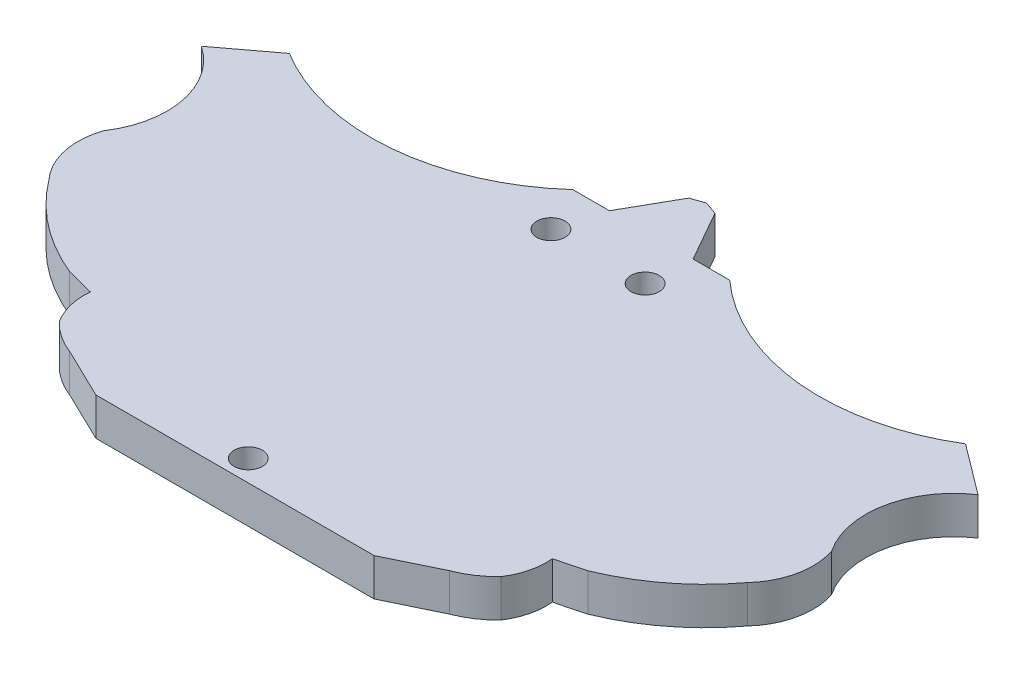
ISO-10303-21;
HEADER;
FILE_DESCRIPTION(('STEP AP214'),'2;1');
FILE_NAME('part.step','',(''),(''),'','','');
FILE_SCHEMA(('AUTOMOTIVE_DESIGN { 1 0 10303 214 1 1 1 1 }'));
ENDSEC;
DATA;
#1=APPLICATION_CONTEXT('core data for automotive mechanical design processes');
#2=APPLICATION_PROTOCOL_DEFINITION('international standard','automotive_design',2000,#1);
#3=PRODUCT_CONTEXT('',#1,'mechanical');
#4=PRODUCT('Part','Part','',(#3));
#5=PRODUCT_RELATED_PRODUCT_CATEGORY('part','',(#4));
#6=PRODUCT_DEFINITION_FORMATION('','',#4);
#7=PRODUCT_DEFINITION_CONTEXT('part definition',#1,'design');
#8=PRODUCT_DEFINITION('design','',#6,#7);
#9=PRODUCT_DEFINITION_SHAPE('','',#8);
#10=(LENGTH_UNIT() NAMED_UNIT(*) SI_UNIT(.MILLI.,.METRE.));
#11=(NAMED_UNIT(*) PLANE_ANGLE_UNIT() SI_UNIT($,.RADIAN.));
#12=(NAMED_UNIT(*) SI_UNIT($,.STERADIAN.) SOLID_ANGLE_UNIT());
#13=UNCERTAINTY_MEASURE_WITH_UNIT(LENGTH_MEASURE(1.E-05),#10,'distance_accuracy_value','');
#14=(GEOMETRIC_REPRESENTATION_CONTEXT(3) GLOBAL_UNCERTAINTY_ASSIGNED_CONTEXT((#13)) GLOBAL_UNIT_ASSIGNED_CONTEXT((#10,
#11,#12)) REPRESENTATION_CONTEXT('',''));
#15=CARTESIAN_POINT('',(0.,0.,0.));
#16=DIRECTION('',(0.,0.,1.));
#17=DIRECTION('',(1.,0.,0.));
#18=AXIS2_PLACEMENT_3D('',#15,#16,#17);
#19=CARTESIAN_POINT('',(-11.9681457477177,3.,24.5157227328065));
#20=DIRECTION('',(0.435219585741613,0.,-0.900324337217927));
#21=DIRECTION('',(-0.900324337217927,0.,-0.435219585741613));
#22=AXIS2_PLACEMENT_3D('',#19,#20,#21);
#23=PLANE('',#22);
#24=DIRECTION('',(0.900324337217927,0.,0.435219585741613));
#25=VECTOR('',#24,1.);
#26=CARTESIAN_POINT('',(-11.9681457477177,-1.,24.5157227328065));
#27=LINE('',#26,#25);
#28=CARTESIAN_POINT('',(-20.1802491308316,-1.,20.5459664075357));
#29=VERTEX_POINT('',#28);
#30=CARTESIAN_POINT('',(-14.7831965238283,-1.,23.1549184293193));
#31=VERTEX_POINT('',#30);
#32=EDGE_CURVE('E237',#29,#31,#27,.T.);
#33=ORIENTED_EDGE('',*,*,#32,.T.);
#34=DIRECTION('',(0.,-1.,0.));
#35=VECTOR('',#34,1.);
#36=CARTESIAN_POINT('',(-14.7831965238283,3.,23.1549184293193));
#37=LINE('',#36,#35);
#38=CARTESIAN_POINT('',(-14.7831965238283,3.,23.1549184293193));
#39=VERTEX_POINT('',#38);
#40=EDGE_CURVE('E11',#39,#31,#37,.T.);
#41=ORIENTED_EDGE('',*,*,#40,.F.);
#42=DIRECTION('',(0.900324337217927,0.,0.435219585741613));
#43=VECTOR('',#42,1.);
#44=CARTESIAN_POINT('',(-11.9681457477177,3.,24.5157227328065));
#45=LINE('',#44,#43);
#46=CARTESIAN_POINT('',(-20.1802491308316,3.,20.5459664075357));
#47=VERTEX_POINT('',#46);
#48=EDGE_CURVE('E301',#47,#39,#45,.T.);
#49=ORIENTED_EDGE('',*,*,#48,.F.);
#50=DIRECTION('',(0.,-1.,0.));
#51=VECTOR('',#50,1.);
#52=CARTESIAN_POINT('',(-20.1802491308316,3.,20.5459664075357));
#53=LINE('',#52,#51);
#54=EDGE_CURVE('E233',#47,#29,#53,.T.);
#55=ORIENTED_EDGE('',*,*,#54,.T.);
#56=EDGE_LOOP('',(#33,#41,#49,#55));
#57=FACE_BOUND('',#56,.T.);
#58=ADVANCED_FACE('F38',(#57),#23,.F.);
#59=CARTESIAN_POINT('',(0.,3.,23.1549184293193));
#60=DIRECTION('',(0.,0.,-1.));
#61=DIRECTION('',(-1.,0.,0.));
#62=AXIS2_PLACEMENT_3D('',#59,#60,#61);
#63=PLANE('',#62);
#64=DIRECTION('',(1.,0.,0.));
#65=VECTOR('',#64,1.);
#66=CARTESIAN_POINT('',(0.,-1.,23.1549184293193));
#67=LINE('',#66,#65);
#68=CARTESIAN_POINT('',(14.7831965238283,-1.,23.1549184293193));
#69=VERTEX_POINT('',#68);
#70=EDGE_CURVE('E240',#31,#69,#67,.T.);
#71=ORIENTED_EDGE('',*,*,#70,.T.);
#72=DIRECTION('',(0.,-1.,0.));
#73=VECTOR('',#72,1.);
#74=CARTESIAN_POINT('',(14.7831965238283,3.,23.1549184293193));
#75=LINE('',#74,#73);
#76=CARTESIAN_POINT('',(14.7831965238283,3.,23.1549184293193));
#77=VERTEX_POINT('',#76);
#78=EDGE_CURVE('E47',#77,#69,#75,.T.);
#79=ORIENTED_EDGE('',*,*,#78,.F.);
#80=DIRECTION('',(1.,0.,0.));
#81=VECTOR('',#80,1.);
#82=CARTESIAN_POINT('',(0.,3.,23.1549184293193));
#83=LINE('',#82,#81);
#84=EDGE_CURVE('E149',#39,#77,#83,.T.);
#85=ORIENTED_EDGE('',*,*,#84,.F.);
#86=ORIENTED_EDGE('',*,*,#40,.T.);
#87=EDGE_LOOP('',(#71,#79,#85,#86));
#88=FACE_BOUND('',#87,.T.);
#89=ADVANCED_FACE('F352',(#88),#63,.F.);
#90=CARTESIAN_POINT('',(11.9681457477177,3.,24.5157227328065));
#91=DIRECTION('',(0.435219585741613,0.,0.900324337217927));
#92=DIRECTION('',(0.900324337217927,0.,-0.435219585741613));
#93=AXIS2_PLACEMENT_3D('',#90,#91,#92);
#94=PLANE('',#93);
#95=DIRECTION('',(-0.900324337217927,0.,0.435219585741613));
#96=VECTOR('',#95,1.);
#97=CARTESIAN_POINT('',(11.9681457477177,-1.,24.5157227328065));
#98=LINE('',#97,#96);
#99=CARTESIAN_POINT('',(20.1802491308316,-1.,20.5459664075357));
#100=VERTEX_POINT('',#99);
#101=EDGE_CURVE('E244',#100,#69,#98,.T.);
#102=ORIENTED_EDGE('',*,*,#101,.F.);
#103=DIRECTION('',(0.,-1.,0.));
#104=VECTOR('',#103,1.);
#105=CARTESIAN_POINT('',(20.1802491308316,3.,20.5459664075357));
#106=LINE('',#105,#104);
#107=CARTESIAN_POINT('',(20.1802491308316,3.,20.5459664075357));
#108=VERTEX_POINT('',#107);
#109=EDGE_CURVE('E344',#108,#100,#106,.T.);
#110=ORIENTED_EDGE('',*,*,#109,.F.);
#111=DIRECTION('',(-0.900324337217927,0.,0.435219585741613));
#112=VECTOR('',#111,1.);
#113=CARTESIAN_POINT('',(11.9681457477177,3.,24.5157227328065));
#114=LINE('',#113,#112);
#115=EDGE_CURVE('E351',#108,#77,#114,.T.);
#116=ORIENTED_EDGE('',*,*,#115,.T.);
#117=ORIENTED_EDGE('',*,*,#78,.T.);
#118=EDGE_LOOP('',(#102,#110,#116,#117));
#119=FACE_BOUND('',#118,.T.);
#120=ADVANCED_FACE('F349',(#119),#94,.T.);
#121=CARTESIAN_POINT('',(17.0103360766643,3.,12.2221993345838));
#122=DIRECTION('',(0.,-1.,0.));
#123=DIRECTION('',(0.,0.,-1.));
#124=AXIS2_PLACEMENT_3D('',#121,#122,#123);
#125=CYLINDRICAL_SURFACE('',#124,8.90693252785372);
#126=CARTESIAN_POINT('',(17.0103360766643,-1.,12.2221993345838));
#127=DIRECTION('',(0.,1.,0.));
#128=DIRECTION('',(0.,0.,1.));
#129=AXIS2_PLACEMENT_3D('',#126,#127,#128);
#130=CIRCLE('',#129,8.90693252785372);
#131=CARTESIAN_POINT('',(23.4746160462479,-1.,18.3497217972582));
#132=VERTEX_POINT('',#131);
#133=EDGE_CURVE('E247',#132,#100,#130,.F.);
#134=ORIENTED_EDGE('',*,*,#133,.F.);
#135=DIRECTION('',(0.,-1.,0.));
#136=VECTOR('',#135,1.);
#137=CARTESIAN_POINT('',(23.4746160462479,3.,18.3497217972582));
#138=LINE('',#137,#136);
#139=CARTESIAN_POINT('',(23.4746160462479,3.,18.3497217972582));
#140=VERTEX_POINT('',#139);
#141=EDGE_CURVE('E342',#140,#132,#138,.T.);
#142=ORIENTED_EDGE('',*,*,#141,.F.);
#143=CARTESIAN_POINT('',(17.0103360766643,3.,12.2221993345838));
#144=DIRECTION('',(0.,1.,0.));
#145=DIRECTION('',(0.,0.,1.));
#146=AXIS2_PLACEMENT_3D('',#143,#144,#145);
#147=CIRCLE('',#146,8.90693252785372);
#148=EDGE_CURVE('E363',#140,#108,#147,.F.);
#149=ORIENTED_EDGE('',*,*,#148,.T.);
#150=ORIENTED_EDGE('',*,*,#109,.T.);
#151=EDGE_LOOP('',(#134,#142,#149,#150));
#152=FACE_BOUND('',#151,.T.);
#153=ADVANCED_FACE('F360',(#152),#125,.T.);
#154=CARTESIAN_POINT('',(17.7774119070791,3.,14.6226218835628));
#155=DIRECTION('',(0.,-1.,0.));
#156=DIRECTION('',(0.,0.,-1.));
#157=AXIS2_PLACEMENT_3D('',#154,#155,#156);
#158=CYLINDRICAL_SURFACE('',#157,6.80804000943221);
#159=CARTESIAN_POINT('',(17.7774119070791,-1.,14.6226218835628));
#160=DIRECTION('',(0.,1.,0.));
#161=DIRECTION('',(0.,0.,1.));
#162=AXIS2_PLACEMENT_3D('',#159,#160,#161);
#163=CIRCLE('',#162,6.80804000943221);
#164=CARTESIAN_POINT('',(24.55337257074,-1.,13.9624962481343));
#165=VERTEX_POINT('',#164);
#166=EDGE_CURVE('E250',#165,#132,#163,.F.);
#167=ORIENTED_EDGE('',*,*,#166,.F.);
#168=DIRECTION('',(0.,-1.,0.));
#169=VECTOR('',#168,1.);
#170=CARTESIAN_POINT('',(24.55337257074,3.,13.9624962481343));
#171=LINE('',#170,#169);
#172=CARTESIAN_POINT('',(24.55337257074,3.,13.9624962481343));
#173=VERTEX_POINT('',#172);
#174=EDGE_CURVE('E340',#173,#165,#171,.T.);
#175=ORIENTED_EDGE('',*,*,#174,.F.);
#176=CARTESIAN_POINT('',(17.7774119070791,3.,14.6226218835628));
#177=DIRECTION('',(0.,1.,0.));
#178=DIRECTION('',(0.,0.,1.));
#179=AXIS2_PLACEMENT_3D('',#176,#177,#178);
#180=CIRCLE('',#179,6.80804000943221);
#181=EDGE_CURVE('E367',#173,#140,#180,.F.);
#182=ORIENTED_EDGE('',*,*,#181,.T.);
#183=ORIENTED_EDGE('',*,*,#141,.T.);
#184=EDGE_LOOP('',(#167,#175,#182,#183));
#185=FACE_BOUND('',#184,.T.);
#186=ADVANCED_FACE('F447',(#185),#158,.T.);
#187=CARTESIAN_POINT('',(9.25185208114311,3.,-51.291423693243));
#188=DIRECTION('',(0.,-1.,0.));
#189=DIRECTION('',(0.,0.,-1.));
#190=AXIS2_PLACEMENT_3D('',#187,#188,#189);
#191=CYLINDRICAL_SURFACE('',#190,67.0239553966284);
#192=CARTESIAN_POINT('',(9.25185208114311,-1.,-51.291423693243));
#193=DIRECTION('',(0.,1.,0.));
#194=DIRECTION('',(0.,0.,1.));
#195=AXIS2_PLACEMENT_3D('',#192,#193,#194);
#196=CIRCLE('',#195,67.0239553966284);
#197=CARTESIAN_POINT('',(27.5662579793674,-1.,13.1817733238455));
#198=VERTEX_POINT('',#197);
#199=EDGE_CURVE('E253',#198,#165,#196,.F.);
#200=ORIENTED_EDGE('',*,*,#199,.F.);
#201=DIRECTION('',(0.,-1.,0.));
#202=VECTOR('',#201,1.);
#203=CARTESIAN_POINT('',(27.5662579793674,3.,13.1817733238455));
#204=LINE('',#203,#202);
#205=CARTESIAN_POINT('',(27.5662579793674,3.,13.1817733238455));
#206=VERTEX_POINT('',#205);
#207=EDGE_CURVE('E338',#206,#198,#204,.T.);
#208=ORIENTED_EDGE('',*,*,#207,.F.);
#209=CARTESIAN_POINT('',(9.25185208114311,3.,-51.291423693243));
#210=DIRECTION('',(0.,1.,0.));
#211=DIRECTION('',(0.,0.,1.));
#212=AXIS2_PLACEMENT_3D('',#209,#210,#211);
#213=CIRCLE('',#212,67.0239553966284);
#214=EDGE_CURVE('E373',#206,#173,#213,.F.);
#215=ORIENTED_EDGE('',*,*,#214,.T.);
#216=ORIENTED_EDGE('',*,*,#174,.T.);
#217=EDGE_LOOP('',(#200,#208,#215,#216));
#218=FACE_BOUND('',#217,.T.);
#219=ADVANCED_FACE('F450',(#218),#191,.T.);
#220=CARTESIAN_POINT('',(18.9970102692638,3.,-7.77880711033361));
#221=DIRECTION('',(0.,-1.,0.));
#222=DIRECTION('',(0.,0.,-1.));
#223=AXIS2_PLACEMENT_3D('',#220,#221,#222);
#224=CYLINDRICAL_SURFACE('',#223,22.6446006468387);
#225=CARTESIAN_POINT('',(18.9970102692638,-1.,-7.77880711033361));
#226=DIRECTION('',(0.,1.,0.));
#227=DIRECTION('',(0.,0.,1.));
#228=AXIS2_PLACEMENT_3D('',#225,#226,#227);
#229=CIRCLE('',#228,22.6446006468387);
#230=CARTESIAN_POINT('',(37.1179234229745,-1.,5.8009736290775));
#231=VERTEX_POINT('',#230);
#232=EDGE_CURVE('E256',#231,#198,#229,.F.);
#233=ORIENTED_EDGE('',*,*,#232,.F.);
#234=DIRECTION('',(0.,-1.,0.));
#235=VECTOR('',#234,1.);
#236=CARTESIAN_POINT('',(37.1179234229745,3.,5.8009736290775));
#237=LINE('',#236,#235);
#238=CARTESIAN_POINT('',(37.1179234229745,3.,5.8009736290775));
#239=VERTEX_POINT('',#238);
#240=EDGE_CURVE('E336',#239,#231,#237,.T.);
#241=ORIENTED_EDGE('',*,*,#240,.F.);
#242=CARTESIAN_POINT('',(18.9970102692638,3.,-7.77880711033361));
#243=DIRECTION('',(0.,1.,0.));
#244=DIRECTION('',(0.,0.,1.));
#245=AXIS2_PLACEMENT_3D('',#242,#243,#244);
#246=CIRCLE('',#245,22.6446006468387);
#247=EDGE_CURVE('E376',#239,#206,#246,.F.);
#248=ORIENTED_EDGE('',*,*,#247,.T.);
#249=ORIENTED_EDGE('',*,*,#207,.T.);
#250=EDGE_LOOP('',(#233,#241,#248,#249));
#251=FACE_BOUND('',#250,.T.);
#252=ADVANCED_FACE('F454',(#251),#224,.T.);
#253=CARTESIAN_POINT('',(31.6399917117448,3.,0.777953508331709));
#254=DIRECTION('',(0.,-1.,0.));
#255=DIRECTION('',(0.,0.,-1.));
#256=AXIS2_PLACEMENT_3D('',#253,#254,#255);
#257=CYLINDRICAL_SURFACE('',#256,7.43225853737031);
#258=CARTESIAN_POINT('',(31.6399917117448,-1.,0.777953508331709));
#259=DIRECTION('',(0.,1.,0.));
#260=DIRECTION('',(0.,0.,1.));
#261=AXIS2_PLACEMENT_3D('',#258,#259,#260);
#262=CIRCLE('',#261,7.43225853737031);
#263=CARTESIAN_POINT('',(38.692235530154,-1.,-1.56817608996891));
#264=VERTEX_POINT('',#263);
#265=EDGE_CURVE('E259',#264,#231,#262,.F.);
#266=ORIENTED_EDGE('',*,*,#265,.F.);
#267=DIRECTION('',(0.,-1.,0.));
#268=VECTOR('',#267,1.);
#269=CARTESIAN_POINT('',(38.692235530154,3.,-1.56817608996891));
#270=LINE('',#269,#268);
#271=CARTESIAN_POINT('',(38.692235530154,3.,-1.56817608996891));
#272=VERTEX_POINT('',#271);
#273=EDGE_CURVE('E334',#272,#264,#270,.T.);
#274=ORIENTED_EDGE('',*,*,#273,.F.);
#275=CARTESIAN_POINT('',(31.6399917117448,3.,0.777953508331709));
#276=DIRECTION('',(0.,1.,0.));
#277=DIRECTION('',(0.,0.,1.));
#278=AXIS2_PLACEMENT_3D('',#275,#276,#277);
#279=CIRCLE('',#278,7.43225853737031);
#280=EDGE_CURVE('E379',#272,#239,#279,.F.);
#281=ORIENTED_EDGE('',*,*,#280,.T.);
#282=ORIENTED_EDGE('',*,*,#240,.T.);
#283=EDGE_LOOP('',(#266,#274,#281,#282));
#284=FACE_BOUND('',#283,.T.);
#285=ADVANCED_FACE('F458',(#284),#257,.T.);
#286=CARTESIAN_POINT('',(46.4728637491519,3.,-6.76208916433522));
#287=DIRECTION('',(0.,-1.,0.));
#288=DIRECTION('',(0.,0.,-1.));
#289=AXIS2_PLACEMENT_3D('',#286,#287,#288);
#290=CYLINDRICAL_SURFACE('',#289,9.35494032617735);
#291=CARTESIAN_POINT('',(46.4728637491519,-1.,-6.76208916433522));
#292=DIRECTION('',(0.,1.,0.));
#293=DIRECTION('',(0.,0.,1.));
#294=AXIS2_PLACEMENT_3D('',#291,#292,#293);
#295=CIRCLE('',#294,9.35494032617735);
#296=CARTESIAN_POINT('',(41.2789506747852,-1.,-14.5427173833328));
#297=VERTEX_POINT('',#296);
#298=EDGE_CURVE('E262',#297,#264,#295,.T.);
#299=ORIENTED_EDGE('',*,*,#298,.F.);
#300=DIRECTION('',(0.,-1.,0.));
#301=VECTOR('',#300,1.);
#302=CARTESIAN_POINT('',(41.2789506747852,3.,-14.5427173833328));
#303=LINE('',#302,#301);
#304=CARTESIAN_POINT('',(41.2789506747852,3.,-14.5427173833328));
#305=VERTEX_POINT('',#304);
#306=EDGE_CURVE('E332',#305,#297,#303,.T.);
#307=ORIENTED_EDGE('',*,*,#306,.F.);
#308=CARTESIAN_POINT('',(46.4728637491519,3.,-6.76208916433522));
#309=DIRECTION('',(0.,1.,0.));
#310=DIRECTION('',(0.,0.,1.));
#311=AXIS2_PLACEMENT_3D('',#308,#309,#310);
#312=CIRCLE('',#311,9.35494032617735);
#313=EDGE_CURVE('E382',#305,#272,#312,.T.);
#314=ORIENTED_EDGE('',*,*,#313,.T.);
#315=ORIENTED_EDGE('',*,*,#273,.T.);
#316=EDGE_LOOP('',(#299,#307,#314,#315));
#317=FACE_BOUND('',#316,.T.);
#318=ADVANCED_FACE('F462',(#317),#290,.F.);
#319=CARTESIAN_POINT('',(21.7826576918409,3.,-29.2055275113583));
#320=DIRECTION('',(-0.601064363897763,0.,0.799200619652023));
#321=DIRECTION('',(0.799200619652023,0.,0.601064363897763));
#322=AXIS2_PLACEMENT_3D('',#319,#320,#321);
#323=PLANE('',#322);
#324=DIRECTION('',(-0.799200619652023,0.,-0.601064363897763));
#325=VECTOR('',#324,1.);
#326=CARTESIAN_POINT('',(21.7826576918409,-1.,-29.2055275113583));
#327=LINE('',#326,#325);
#328=CARTESIAN_POINT('',(35.9347751021454,-1.,-18.5619753920733));
#329=VERTEX_POINT('',#328);
#330=EDGE_CURVE('E265',#297,#329,#327,.T.);
#331=ORIENTED_EDGE('',*,*,#330,.T.);
#332=DIRECTION('',(0.,-1.,0.));
#333=VECTOR('',#332,1.);
#334=CARTESIAN_POINT('',(35.9347751021454,3.,-18.5619753920733));
#335=LINE('',#334,#333);
#336=CARTESIAN_POINT('',(35.9347751021454,3.,-18.5619753920733));
#337=VERTEX_POINT('',#336);
#338=EDGE_CURVE('E330',#337,#329,#335,.T.);
#339=ORIENTED_EDGE('',*,*,#338,.F.);
#340=DIRECTION('',(-0.799200619652023,0.,-0.601064363897763));
#341=VECTOR('',#340,1.);
#342=CARTESIAN_POINT('',(21.7826576918409,3.,-29.2055275113583));
#343=LINE('',#342,#341);
#344=EDGE_CURVE('E385',#305,#337,#343,.T.);
#345=ORIENTED_EDGE('',*,*,#344,.F.);
#346=ORIENTED_EDGE('',*,*,#306,.T.);
#347=EDGE_LOOP('',(#331,#339,#345,#346));
#348=FACE_BOUND('',#347,.T.);
#349=ADVANCED_FACE('F466',(#348),#323,.F.);
#350=CARTESIAN_POINT('',(23.8296768106751,3.,-38.2961481041698));
#351=DIRECTION('',(0.,-1.,0.));
#352=DIRECTION('',(0.,0.,-1.));
#353=AXIS2_PLACEMENT_3D('',#350,#351,#352);
#354=CYLINDRICAL_SURFACE('',#353,23.151047001745);
#355=CARTESIAN_POINT('',(23.8296768106751,-1.,-38.2961481041698));
#356=DIRECTION('',(0.,1.,0.));
#357=DIRECTION('',(0.,0.,1.));
#358=AXIS2_PLACEMENT_3D('',#355,#356,#357);
#359=CIRCLE('',#358,23.151047001745);
#360=CARTESIAN_POINT('',(8.33896874436669,-1.,-21.0912377329585));
#361=VERTEX_POINT('',#360);
#362=EDGE_CURVE('E268',#361,#329,#359,.T.);
#363=ORIENTED_EDGE('',*,*,#362,.F.);
#364=DIRECTION('',(0.,-1.,0.));
#365=VECTOR('',#364,1.);
#366=CARTESIAN_POINT('',(8.33896874436669,3.,-21.0912377329585));
#367=LINE('',#366,#365);
#368=CARTESIAN_POINT('',(8.33896874436669,3.,-21.0912377329585));
#369=VERTEX_POINT('',#368);
#370=EDGE_CURVE('E328',#369,#361,#367,.T.);
#371=ORIENTED_EDGE('',*,*,#370,.F.);
#372=CARTESIAN_POINT('',(23.8296768106751,3.,-38.2961481041698));
#373=DIRECTION('',(0.,1.,0.));
#374=DIRECTION('',(0.,0.,1.));
#375=AXIS2_PLACEMENT_3D('',#372,#373,#374);
#376=CIRCLE('',#375,23.151047001745);
#377=EDGE_CURVE('E387',#369,#337,#376,.T.);
#378=ORIENTED_EDGE('',*,*,#377,.T.);
#379=ORIENTED_EDGE('',*,*,#338,.T.);
#380=EDGE_LOOP('',(#363,#371,#378,#379));
#381=FACE_BOUND('',#380,.T.);
#382=ADVANCED_FACE('F470',(#381),#354,.F.);
#383=CARTESIAN_POINT('',(0.,3.,-21.0912377329585));
#384=DIRECTION('',(0.,0.,-1.));
#385=DIRECTION('',(-1.,0.,0.));
#386=AXIS2_PLACEMENT_3D('',#383,#384,#385);
#387=PLANE('',#386);
#388=DIRECTION('',(1.,0.,0.));
#389=VECTOR('',#388,1.);
#390=CARTESIAN_POINT('',(0.,-1.,-21.0912377329585));
#391=LINE('',#390,#389);
#392=CARTESIAN_POINT('',(4.44827769626541,-1.,-21.0912377329585));
#393=VERTEX_POINT('',#392);
#394=EDGE_CURVE('E271',#393,#361,#391,.T.);
#395=ORIENTED_EDGE('',*,*,#394,.F.);
#396=DIRECTION('',(0.,-1.,0.));
#397=VECTOR('',#396,1.);
#398=CARTESIAN_POINT('',(4.44827769626541,3.,-21.0912377329585));
#399=LINE('',#398,#397);
#400=CARTESIAN_POINT('',(4.44827769626541,3.,-21.0912377329585));
#401=VERTEX_POINT('',#400);
#402=EDGE_CURVE('E326',#401,#393,#399,.T.);
#403=ORIENTED_EDGE('',*,*,#402,.F.);
#404=DIRECTION('',(1.,0.,0.));
#405=VECTOR('',#404,1.);
#406=CARTESIAN_POINT('',(0.,3.,-21.0912377329585));
#407=LINE('',#406,#405);
#408=EDGE_CURVE('E390',#401,#369,#407,.T.);
#409=ORIENTED_EDGE('',*,*,#408,.T.);
#410=ORIENTED_EDGE('',*,*,#370,.T.);
#411=EDGE_LOOP('',(#395,#403,#409,#410));
#412=FACE_BOUND('',#411,.T.);
#413=ADVANCED_FACE('F474',(#412),#387,.T.);
#414=CARTESIAN_POINT('',(12.3165672492831,3.,-7.23776431661375));
#415=DIRECTION('',(-0.869537482646765,0.,0.493866951994489));
#416=DIRECTION('',(0.493866951994489,0.,0.869537482646765));
#417=AXIS2_PLACEMENT_3D('',#414,#415,#416);
#418=PLANE('',#417);
#419=DIRECTION('',(-0.493866951994489,0.,-0.869537482646765));
#420=VECTOR('',#419,1.);
#421=CARTESIAN_POINT('',(12.3165672492831,-1.,-7.23776431661375));
#422=LINE('',#421,#420);
#423=CARTESIAN_POINT('',(1.39220905189552,-1.,-26.4719707929239));
#424=VERTEX_POINT('',#423);
#425=EDGE_CURVE('E274',#393,#424,#422,.T.);
#426=ORIENTED_EDGE('',*,*,#425,.T.);
#427=DIRECTION('',(0.,-1.,0.));
#428=VECTOR('',#427,1.);
#429=CARTESIAN_POINT('',(1.39220905189552,3.,-26.4719707929239));
#430=LINE('',#429,#428);
#431=CARTESIAN_POINT('',(1.39220905189552,3.,-26.4719707929239));
#432=VERTEX_POINT('',#431);
#433=EDGE_CURVE('E323',#432,#424,#430,.T.);
#434=ORIENTED_EDGE('',*,*,#433,.F.);
#435=DIRECTION('',(-0.493866951994489,0.,-0.869537482646765));
#436=VECTOR('',#435,1.);
#437=CARTESIAN_POINT('',(12.3165672492831,3.,-7.23776431661375));
#438=LINE('',#437,#436);
#439=EDGE_CURVE('E393',#401,#432,#438,.T.);
#440=ORIENTED_EDGE('',*,*,#439,.F.);
#441=ORIENTED_EDGE('',*,*,#402,.T.);
#442=EDGE_LOOP('',(#426,#434,#440,#441));
#443=FACE_BOUND('',#442,.T.);
#444=ADVANCED_FACE('F476',(#443),#418,.F.);
#445=CARTESIAN_POINT('',(8.31902601269563,3.,-24.0517290807408));
#446=DIRECTION('',(-0.329847212168242,0.,0.944034330215188));
#447=DIRECTION('',(0.944034330215188,0.,0.329847212168242));
#448=AXIS2_PLACEMENT_3D('',#445,#446,#447);
#449=PLANE('',#448);
#450=DIRECTION('',(-0.944034330215188,0.,-0.329847212168242));
#451=VECTOR('',#450,1.);
#452=CARTESIAN_POINT('',(8.31902601269563,-1.,-24.0517290807408));
#453=LINE('',#452,#451);
#454=CARTESIAN_POINT('',(0.,-1.,-26.9584110205991));
#455=VERTEX_POINT('',#454);
#456=EDGE_CURVE('E277',#424,#455,#453,.T.);
#457=ORIENTED_EDGE('',*,*,#456,.T.);
#458=DIRECTION('',(0.,-1.,0.));
#459=VECTOR('',#458,1.);
#460=CARTESIAN_POINT('',(0.,3.,-26.9584110205991));
#461=LINE('',#460,#459);
#462=CARTESIAN_POINT('',(0.,3.,-26.9584110205991));
#463=VERTEX_POINT('',#462);
#464=EDGE_CURVE('E321',#463,#455,#461,.T.);
#465=ORIENTED_EDGE('',*,*,#464,.F.);
#466=DIRECTION('',(-0.944034330215188,0.,-0.329847212168242));
#467=VECTOR('',#466,1.);
#468=CARTESIAN_POINT('',(8.31902601269563,3.,-24.0517290807408));
#469=LINE('',#468,#467);
#470=EDGE_CURVE('E396',#432,#463,#469,.T.);
#471=ORIENTED_EDGE('',*,*,#470,.F.);
#472=ORIENTED_EDGE('',*,*,#433,.T.);
#473=EDGE_LOOP('',(#457,#465,#471,#472));
#474=FACE_BOUND('',#473,.T.);
#475=ADVANCED_FACE('F479',(#474),#449,.F.);
#476=CARTESIAN_POINT('',(-8.31902601269563,3.,-24.0517290807408));
#477=DIRECTION('',(-0.329847212168242,0.,-0.944034330215188));
#478=DIRECTION('',(-0.944034330215188,0.,0.329847212168242));
#479=AXIS2_PLACEMENT_3D('',#476,#477,#478);
#480=PLANE('',#479);
#481=DIRECTION('',(0.944034330215188,0.,-0.329847212168242));
#482=VECTOR('',#481,1.);
#483=CARTESIAN_POINT('',(-8.31902601269563,-1.,-24.0517290807408));
#484=LINE('',#483,#482);
#485=CARTESIAN_POINT('',(-1.39220905189553,-1.,-26.4719707929239));
#486=VERTEX_POINT('',#485);
#487=EDGE_CURVE('E280',#486,#455,#484,.T.);
#488=ORIENTED_EDGE('',*,*,#487,.F.);
#489=DIRECTION('',(0.,-1.,0.));
#490=VECTOR('',#489,1.);
#491=CARTESIAN_POINT('',(-1.39220905189553,3.,-26.4719707929239));
#492=LINE('',#491,#490);
#493=CARTESIAN_POINT('',(-1.39220905189553,3.,-26.4719707929239));
#494=VERTEX_POINT('',#493);
#495=EDGE_CURVE('E319',#494,#486,#492,.T.);
#496=ORIENTED_EDGE('',*,*,#495,.F.);
#497=DIRECTION('',(0.944034330215188,0.,-0.329847212168242));
#498=VECTOR('',#497,1.);
#499=CARTESIAN_POINT('',(-8.31902601269563,3.,-24.0517290807408));
#500=LINE('',#499,#498);
#501=EDGE_CURVE('E398',#494,#463,#500,.T.);
#502=ORIENTED_EDGE('',*,*,#501,.T.);
#503=ORIENTED_EDGE('',*,*,#464,.T.);
#504=EDGE_LOOP('',(#488,#496,#502,#503));
#505=FACE_BOUND('',#504,.T.);
#506=ADVANCED_FACE('F483',(#505),#480,.T.);
#507=CARTESIAN_POINT('',(-12.3165672492831,3.,-7.23776431661378));
#508=DIRECTION('',(-0.869537482646764,0.,-0.49386695199449));
#509=DIRECTION('',(-0.49386695199449,0.,0.869537482646764));
#510=AXIS2_PLACEMENT_3D('',#507,#508,#509);
#511=PLANE('',#510);
#512=DIRECTION('',(0.49386695199449,0.,-0.869537482646764));
#513=VECTOR('',#512,1.);
#514=CARTESIAN_POINT('',(-12.3165672492831,-1.,-7.23776431661378));
#515=LINE('',#514,#513);
#516=CARTESIAN_POINT('',(-4.44827769626543,-1.,-21.0912377329585));
#517=VERTEX_POINT('',#516);
#518=EDGE_CURVE('E283',#517,#486,#515,.T.);
#519=ORIENTED_EDGE('',*,*,#518,.F.);
#520=DIRECTION('',(0.,-1.,0.));
#521=VECTOR('',#520,1.);
#522=CARTESIAN_POINT('',(-4.44827769626543,3.,-21.0912377329585));
#523=LINE('',#522,#521);
#524=CARTESIAN_POINT('',(-4.44827769626543,3.,-21.0912377329585));
#525=VERTEX_POINT('',#524);
#526=EDGE_CURVE('E317',#525,#517,#523,.T.);
#527=ORIENTED_EDGE('',*,*,#526,.F.);
#528=DIRECTION('',(0.49386695199449,0.,-0.869537482646764));
#529=VECTOR('',#528,1.);
#530=CARTESIAN_POINT('',(-12.3165672492831,3.,-7.23776431661378));
#531=LINE('',#530,#529);
#532=EDGE_CURVE('E401',#525,#494,#531,.T.);
#533=ORIENTED_EDGE('',*,*,#532,.T.);
#534=ORIENTED_EDGE('',*,*,#495,.T.);
#535=EDGE_LOOP('',(#519,#527,#533,#534));
#536=FACE_BOUND('',#535,.T.);
#537=ADVANCED_FACE('F487',(#536),#511,.T.);
#538=CARTESIAN_POINT('',(-8.33896874436671,-1.,-21.0912377329585));
#539=VERTEX_POINT('',#538);
#540=EDGE_CURVE('E275',#539,#517,#391,.T.);
#541=ORIENTED_EDGE('',*,*,#540,.F.);
#542=DIRECTION('',(0.,-1.,0.));
#543=VECTOR('',#542,1.);
#544=CARTESIAN_POINT('',(-8.33896874436671,3.,-21.0912377329585));
#545=LINE('',#544,#543);
#546=CARTESIAN_POINT('',(-8.33896874436671,3.,-21.0912377329585));
#547=VERTEX_POINT('',#546);
#548=EDGE_CURVE('E315',#547,#539,#545,.T.);
#549=ORIENTED_EDGE('',*,*,#548,.F.);
#550=EDGE_CURVE('E394',#547,#525,#407,.T.);
#551=ORIENTED_EDGE('',*,*,#550,.T.);
#552=ORIENTED_EDGE('',*,*,#526,.T.);
#553=EDGE_LOOP('',(#541,#549,#551,#552));
#554=FACE_BOUND('',#553,.T.);
#555=ADVANCED_FACE('F491',(#554),#387,.T.);
#556=CARTESIAN_POINT('',(-23.8296768106752,3.,-38.2961481041698));
#557=DIRECTION('',(0.,-1.,0.));
#558=DIRECTION('',(0.,0.,-1.));
#559=AXIS2_PLACEMENT_3D('',#556,#557,#558);
#560=CYLINDRICAL_SURFACE('',#559,23.151047001745);
#561=CARTESIAN_POINT('',(-23.8296768106752,-1.,-38.2961481041698));
#562=DIRECTION('',(0.,1.,0.));
#563=DIRECTION('',(0.,0.,1.));
#564=AXIS2_PLACEMENT_3D('',#561,#562,#563);
#565=CIRCLE('',#564,23.151047001745);
#566=CARTESIAN_POINT('',(-35.9347751021454,-1.,-18.5619753920733));
#567=VERTEX_POINT('',#566);
#568=EDGE_CURVE('E286',#539,#567,#565,.F.);
#569=ORIENTED_EDGE('',*,*,#568,.T.);
#570=DIRECTION('',(0.,-1.,0.));
#571=VECTOR('',#570,1.);
#572=CARTESIAN_POINT('',(-35.9347751021454,3.,-18.5619753920733));
#573=LINE('',#572,#571);
#574=CARTESIAN_POINT('',(-35.9347751021454,3.,-18.5619753920733));
#575=VERTEX_POINT('',#574);
#576=EDGE_CURVE('E313',#575,#567,#573,.T.);
#577=ORIENTED_EDGE('',*,*,#576,.F.);
#578=CARTESIAN_POINT('',(-23.8296768106752,3.,-38.2961481041698));
#579=DIRECTION('',(0.,1.,0.));
#580=DIRECTION('',(0.,0.,1.));
#581=AXIS2_PLACEMENT_3D('',#578,#579,#580);
#582=CIRCLE('',#581,23.151047001745);
#583=EDGE_CURVE('E404',#547,#575,#582,.F.);
#584=ORIENTED_EDGE('',*,*,#583,.F.);
#585=ORIENTED_EDGE('',*,*,#548,.T.);
#586=EDGE_LOOP('',(#569,#577,#584,#585));
#587=FACE_BOUND('',#586,.T.);
#588=ADVANCED_FACE('F495',(#587),#560,.F.);
#589=CARTESIAN_POINT('',(-21.7826576918409,3.,-29.2055275113583));
#590=DIRECTION('',(-0.601064363897763,0.,-0.799200619652023));
#591=DIRECTION('',(-0.799200619652023,0.,0.601064363897763));
#592=AXIS2_PLACEMENT_3D('',#589,#590,#591);
#593=PLANE('',#592);
#594=DIRECTION('',(0.799200619652023,0.,-0.601064363897763));
#595=VECTOR('',#594,1.);
#596=CARTESIAN_POINT('',(-21.7826576918409,-1.,-29.2055275113583));
#597=LINE('',#596,#595);
#598=CARTESIAN_POINT('',(-41.2789506747852,-1.,-14.5427173833328));
#599=VERTEX_POINT('',#598);
#600=EDGE_CURVE('E289',#599,#567,#597,.T.);
#601=ORIENTED_EDGE('',*,*,#600,.F.);
#602=DIRECTION('',(0.,-1.,0.));
#603=VECTOR('',#602,1.);
#604=CARTESIAN_POINT('',(-41.2789506747852,3.,-14.5427173833328));
#605=LINE('',#604,#603);
#606=CARTESIAN_POINT('',(-41.2789506747852,3.,-14.5427173833328));
#607=VERTEX_POINT('',#606);
#608=EDGE_CURVE('E311',#607,#599,#605,.T.);
#609=ORIENTED_EDGE('',*,*,#608,.F.);
#610=DIRECTION('',(0.799200619652023,0.,-0.601064363897763));
#611=VECTOR('',#610,1.);
#612=CARTESIAN_POINT('',(-21.7826576918409,3.,-29.2055275113583));
#613=LINE('',#612,#611);
#614=EDGE_CURVE('E406',#607,#575,#613,.T.);
#615=ORIENTED_EDGE('',*,*,#614,.T.);
#616=ORIENTED_EDGE('',*,*,#576,.T.);
#617=EDGE_LOOP('',(#601,#609,#615,#616));
#618=FACE_BOUND('',#617,.T.);
#619=ADVANCED_FACE('F499',(#618),#593,.T.);
#620=CARTESIAN_POINT('',(-46.4728637491519,3.,-6.76208916433522));
#621=DIRECTION('',(0.,-1.,0.));
#622=DIRECTION('',(0.,0.,-1.));
#623=AXIS2_PLACEMENT_3D('',#620,#621,#622);
#624=CYLINDRICAL_SURFACE('',#623,9.35494032617735);
#625=CARTESIAN_POINT('',(-46.4728637491519,-1.,-6.76208916433522));
#626=DIRECTION('',(0.,1.,0.));
#627=DIRECTION('',(0.,0.,1.));
#628=AXIS2_PLACEMENT_3D('',#625,#626,#627);
#629=CIRCLE('',#628,9.35494032617735);
#630=CARTESIAN_POINT('',(-38.692235530154,-1.,-1.56817608996891));
#631=VERTEX_POINT('',#630);
#632=EDGE_CURVE('E292',#599,#631,#629,.F.);
#633=ORIENTED_EDGE('',*,*,#632,.T.);
#634=DIRECTION('',(0.,-1.,0.));
#635=VECTOR('',#634,1.);
#636=CARTESIAN_POINT('',(-38.692235530154,3.,-1.56817608996891));
#637=LINE('',#636,#635);
#638=CARTESIAN_POINT('',(-38.692235530154,3.,-1.56817608996891));
#639=VERTEX_POINT('',#638);
#640=EDGE_CURVE('E308',#639,#631,#637,.T.);
#641=ORIENTED_EDGE('',*,*,#640,.F.);
#642=CARTESIAN_POINT('',(-46.4728637491519,3.,-6.76208916433522));
#643=DIRECTION('',(0.,1.,0.));
#644=DIRECTION('',(0.,0.,1.));
#645=AXIS2_PLACEMENT_3D('',#642,#643,#644);
#646=CIRCLE('',#645,9.35494032617735);
#647=EDGE_CURVE('E409',#607,#639,#646,.F.);
#648=ORIENTED_EDGE('',*,*,#647,.F.);
#649=ORIENTED_EDGE('',*,*,#608,.T.);
#650=EDGE_LOOP('',(#633,#641,#648,#649));
#651=FACE_BOUND('',#650,.T.);
#652=ADVANCED_FACE('F503',(#651),#624,.F.);
#653=CARTESIAN_POINT('',(-31.6399917117448,3.,0.777953508331709));
#654=DIRECTION('',(0.,-1.,0.));
#655=DIRECTION('',(0.,0.,-1.));
#656=AXIS2_PLACEMENT_3D('',#653,#654,#655);
#657=CYLINDRICAL_SURFACE('',#656,7.43225853737031);
#658=CARTESIAN_POINT('',(-31.6399917117448,-1.,0.777953508331709));
#659=DIRECTION('',(0.,1.,0.));
#660=DIRECTION('',(0.,0.,1.));
#661=AXIS2_PLACEMENT_3D('',#658,#659,#660);
#662=CIRCLE('',#661,7.43225853737031);
#663=CARTESIAN_POINT('',(-37.1179234229746,-1.,5.80097362907751));
#664=VERTEX_POINT('',#663);
#665=EDGE_CURVE('E294',#631,#664,#662,.T.);
#666=ORIENTED_EDGE('',*,*,#665,.T.);
#667=DIRECTION('',(0.,-1.,0.));
#668=VECTOR('',#667,1.);
#669=CARTESIAN_POINT('',(-37.1179234229746,3.,5.80097362907751));
#670=LINE('',#669,#668);
#671=CARTESIAN_POINT('',(-37.1179234229746,3.,5.80097362907751));
#672=VERTEX_POINT('',#671);
#673=EDGE_CURVE('E305',#672,#664,#670,.T.);
#674=ORIENTED_EDGE('',*,*,#673,.F.);
#675=CARTESIAN_POINT('',(-31.6399917117448,3.,0.777953508331709));
#676=DIRECTION('',(0.,1.,0.));
#677=DIRECTION('',(0.,0.,1.));
#678=AXIS2_PLACEMENT_3D('',#675,#676,#677);
#679=CIRCLE('',#678,7.43225853737031);
#680=EDGE_CURVE('E411',#639,#672,#679,.T.);
#681=ORIENTED_EDGE('',*,*,#680,.F.);
#682=ORIENTED_EDGE('',*,*,#640,.T.);
#683=EDGE_LOOP('',(#666,#674,#681,#682));
#684=FACE_BOUND('',#683,.T.);
#685=ADVANCED_FACE('F418',(#684),#657,.T.);
#686=CARTESIAN_POINT('',(-18.9970102692638,3.,-7.77880711033361));
#687=DIRECTION('',(0.,-1.,0.));
#688=DIRECTION('',(0.,0.,-1.));
#689=AXIS2_PLACEMENT_3D('',#686,#687,#688);
#690=CYLINDRICAL_SURFACE('',#689,22.6446006468387);
#691=CARTESIAN_POINT('',(-18.9970102692638,-1.,-7.77880711033361));
#692=DIRECTION('',(0.,1.,0.));
#693=DIRECTION('',(0.,0.,1.));
#694=AXIS2_PLACEMENT_3D('',#691,#692,#693);
#695=CIRCLE('',#694,22.6446006468387);
#696=CARTESIAN_POINT('',(-27.5662579793674,-1.,13.1817733238455));
#697=VERTEX_POINT('',#696);
#698=EDGE_CURVE('E296',#664,#697,#695,.T.);
#699=ORIENTED_EDGE('',*,*,#698,.T.);
#700=DIRECTION('',(0.,-1.,0.));
#701=VECTOR('',#700,1.);
#702=CARTESIAN_POINT('',(-27.5662579793674,3.,13.1817733238455));
#703=LINE('',#702,#701);
#704=CARTESIAN_POINT('',(-27.5662579793674,3.,13.1817733238455));
#705=VERTEX_POINT('',#704);
#706=EDGE_CURVE('E228',#705,#697,#703,.T.);
#707=ORIENTED_EDGE('',*,*,#706,.F.);
#708=CARTESIAN_POINT('',(-18.9970102692638,3.,-7.77880711033361));
#709=DIRECTION('',(0.,1.,0.));
#710=DIRECTION('',(0.,0.,1.));
#711=AXIS2_PLACEMENT_3D('',#708,#709,#710);
#712=CIRCLE('',#711,22.6446006468387);
#713=EDGE_CURVE('E219',#672,#705,#712,.T.);
#714=ORIENTED_EDGE('',*,*,#713,.F.);
#715=ORIENTED_EDGE('',*,*,#673,.T.);
#716=EDGE_LOOP('',(#699,#707,#714,#715));
#717=FACE_BOUND('',#716,.T.);
#718=ADVANCED_FACE('F422',(#717),#690,.T.);
#719=CARTESIAN_POINT('',(-9.25185208114313,3.,-51.291423693243));
#720=DIRECTION('',(0.,-1.,0.));
#721=DIRECTION('',(0.,0.,-1.));
#722=AXIS2_PLACEMENT_3D('',#719,#720,#721);
#723=CYLINDRICAL_SURFACE('',#722,67.0239553966284);
#724=CARTESIAN_POINT('',(-9.25185208114313,-1.,-51.291423693243));
#725=DIRECTION('',(0.,1.,0.));
#726=DIRECTION('',(0.,0.,1.));
#727=AXIS2_PLACEMENT_3D('',#724,#725,#726);
#728=CIRCLE('',#727,67.0239553966284);
#729=CARTESIAN_POINT('',(-24.55337257074,-1.,13.9624962481343));
#730=VERTEX_POINT('',#729);
#731=EDGE_CURVE('E227',#697,#730,#728,.T.);
#732=ORIENTED_EDGE('',*,*,#731,.T.);
#733=DIRECTION('',(0.,-1.,0.));
#734=VECTOR('',#733,1.);
#735=CARTESIAN_POINT('',(-24.55337257074,3.,13.9624962481343));
#736=LINE('',#735,#734);
#737=CARTESIAN_POINT('',(-24.55337257074,3.,13.9624962481343));
#738=VERTEX_POINT('',#737);
#739=EDGE_CURVE('E224',#738,#730,#736,.T.);
#740=ORIENTED_EDGE('',*,*,#739,.F.);
#741=CARTESIAN_POINT('',(-9.25185208114313,3.,-51.291423693243));
#742=DIRECTION('',(0.,1.,0.));
#743=DIRECTION('',(0.,0.,1.));
#744=AXIS2_PLACEMENT_3D('',#741,#742,#743);
#745=CIRCLE('',#744,67.0239553966284);
#746=EDGE_CURVE('E213',#705,#738,#745,.T.);
#747=ORIENTED_EDGE('',*,*,#746,.F.);
#748=ORIENTED_EDGE('',*,*,#706,.T.);
#749=EDGE_LOOP('',(#732,#740,#747,#748));
#750=FACE_BOUND('',#749,.T.);
#751=ADVANCED_FACE('F225',(#750),#723,.T.);
#752=CARTESIAN_POINT('',(-17.7774119070792,3.,14.6226218835628));
#753=DIRECTION('',(0.,-1.,0.));
#754=DIRECTION('',(0.,0.,-1.));
#755=AXIS2_PLACEMENT_3D('',#752,#753,#754);
#756=CYLINDRICAL_SURFACE('',#755,6.80804000943221);
#757=CARTESIAN_POINT('',(-17.7774119070792,-1.,14.6226218835628));
#758=DIRECTION('',(0.,1.,0.));
#759=DIRECTION('',(0.,0.,1.));
#760=AXIS2_PLACEMENT_3D('',#757,#758,#759);
#761=CIRCLE('',#760,6.80804000943221);
#762=CARTESIAN_POINT('',(-23.4746160462479,-1.,18.3497217972582));
#763=VERTEX_POINT('',#762);
#764=EDGE_CURVE('E135',#730,#763,#761,.T.);
#765=ORIENTED_EDGE('',*,*,#764,.T.);
#766=DIRECTION('',(0.,-1.,0.));
#767=VECTOR('',#766,1.);
#768=CARTESIAN_POINT('',(-23.4746160462479,3.,18.3497217972582));
#769=LINE('',#768,#767);
#770=CARTESIAN_POINT('',(-23.4746160462479,3.,18.3497217972582));
#771=VERTEX_POINT('',#770);
#772=EDGE_CURVE('E229',#771,#763,#769,.T.);
#773=ORIENTED_EDGE('',*,*,#772,.F.);
#774=CARTESIAN_POINT('',(-17.7774119070792,3.,14.6226218835628));
#775=DIRECTION('',(0.,1.,0.));
#776=DIRECTION('',(0.,0.,1.));
#777=AXIS2_PLACEMENT_3D('',#774,#775,#776);
#778=CIRCLE('',#777,6.80804000943221);
#779=EDGE_CURVE('E217',#738,#771,#778,.T.);
#780=ORIENTED_EDGE('',*,*,#779,.F.);
#781=ORIENTED_EDGE('',*,*,#739,.T.);
#782=EDGE_LOOP('',(#765,#773,#780,#781));
#783=FACE_BOUND('',#782,.T.);
#784=ADVANCED_FACE('F231',(#783),#756,.T.);
#785=CARTESIAN_POINT('',(-17.0103360766643,3.,12.2221993345838));
#786=DIRECTION('',(0.,-1.,0.));
#787=DIRECTION('',(0.,0.,-1.));
#788=AXIS2_PLACEMENT_3D('',#785,#786,#787);
#789=CYLINDRICAL_SURFACE('',#788,8.90693252785372);
#790=CARTESIAN_POINT('',(-17.0103360766643,-1.,12.2221993345838));
#791=DIRECTION('',(0.,1.,0.));
#792=DIRECTION('',(0.,0.,1.));
#793=AXIS2_PLACEMENT_3D('',#790,#791,#792);
#794=CIRCLE('',#793,8.90693252785372);
#795=EDGE_CURVE('E141',#763,#29,#794,.T.);
#796=ORIENTED_EDGE('',*,*,#795,.T.);
#797=ORIENTED_EDGE('',*,*,#54,.F.);
#798=CARTESIAN_POINT('',(-17.0103360766643,3.,12.2221993345838));
#799=DIRECTION('',(0.,1.,0.));
#800=DIRECTION('',(0.,0.,1.));
#801=AXIS2_PLACEMENT_3D('',#798,#799,#800);
#802=CIRCLE('',#801,8.90693252785372);
#803=EDGE_CURVE('E55',#771,#47,#802,.T.);
#804=ORIENTED_EDGE('',*,*,#803,.F.);
#805=ORIENTED_EDGE('',*,*,#772,.T.);
#806=EDGE_LOOP('',(#796,#797,#804,#805));
#807=FACE_BOUND('',#806,.T.);
#808=ADVANCED_FACE('F425',(#807),#789,.T.);
#809=CARTESIAN_POINT('',(0.,3.,-0.242383843855438));
#810=DIRECTION('',(0.,1.,0.));
#811=DIRECTION('',(0.,0.,1.));
#812=AXIS2_PLACEMENT_3D('',#809,#810,#811);
#813=PLANE('',#812);
#814=CARTESIAN_POINT('',(-0.849851900138927,3.,20.895328087489));
#815=DIRECTION('',(0.,1.,0.));
#816=DIRECTION('',(0.,0.,1.));
#817=AXIS2_PLACEMENT_3D('',#814,#815,#816);
#818=CIRCLE('',#817,1.5);
#819=CARTESIAN_POINT('',(-0.849851900138927,3.,22.395328087489));
#820=VERTEX_POINT('',#819);
#821=EDGE_CURVE('E601',#820,#820,#818,.T.);
#822=ORIENTED_EDGE('',*,*,#821,.F.);
#823=EDGE_LOOP('',(#822));
#824=FACE_BOUND('',#823,.T.);
#825=CARTESIAN_POINT('',(-5.85153301464355,3.,-16.2835705496586));
#826=DIRECTION('',(0.,1.,0.));
#827=DIRECTION('',(0.,0.,1.));
#828=AXIS2_PLACEMENT_3D('',#825,#826,#827);
#829=CIRCLE('',#828,1.5);
#830=CARTESIAN_POINT('',(-5.85153301464355,3.,-14.7835705496586));
#831=VERTEX_POINT('',#830);
#832=EDGE_CURVE('E612',#831,#831,#829,.T.);
#833=ORIENTED_EDGE('',*,*,#832,.F.);
#834=EDGE_LOOP('',(#833));
#835=FACE_BOUND('',#834,.T.);
#836=CARTESIAN_POINT('',(4.1518292143657,3.,-16.2835705496586));
#837=DIRECTION('',(0.,1.,0.));
#838=DIRECTION('',(0.,0.,1.));
#839=AXIS2_PLACEMENT_3D('',#836,#837,#838);
#840=CIRCLE('',#839,1.5);
#841=CARTESIAN_POINT('',(4.1518292143657,3.,-14.7835705496586));
#842=VERTEX_POINT('',#841);
#843=EDGE_CURVE('E604',#842,#842,#840,.T.);
#844=ORIENTED_EDGE('',*,*,#843,.F.);
#845=EDGE_LOOP('',(#844));
#846=FACE_BOUND('',#845,.T.);
#847=ORIENTED_EDGE('',*,*,#48,.T.);
#848=ORIENTED_EDGE('',*,*,#84,.T.);
#849=ORIENTED_EDGE('',*,*,#115,.F.);
#850=ORIENTED_EDGE('',*,*,#148,.F.);
#851=ORIENTED_EDGE('',*,*,#181,.F.);
#852=ORIENTED_EDGE('',*,*,#214,.F.);
#853=ORIENTED_EDGE('',*,*,#247,.F.);
#854=ORIENTED_EDGE('',*,*,#280,.F.);
#855=ORIENTED_EDGE('',*,*,#313,.F.);
#856=ORIENTED_EDGE('',*,*,#344,.T.);
#857=ORIENTED_EDGE('',*,*,#377,.F.);
#858=ORIENTED_EDGE('',*,*,#408,.F.);
#859=ORIENTED_EDGE('',*,*,#439,.T.);
#860=ORIENTED_EDGE('',*,*,#470,.T.);
#861=ORIENTED_EDGE('',*,*,#501,.F.);
#862=ORIENTED_EDGE('',*,*,#532,.F.);
#863=ORIENTED_EDGE('',*,*,#550,.F.);
#864=ORIENTED_EDGE('',*,*,#583,.T.);
#865=ORIENTED_EDGE('',*,*,#614,.F.);
#866=ORIENTED_EDGE('',*,*,#647,.T.);
#867=ORIENTED_EDGE('',*,*,#680,.T.);
#868=ORIENTED_EDGE('',*,*,#713,.T.);
#869=ORIENTED_EDGE('',*,*,#746,.T.);
#870=ORIENTED_EDGE('',*,*,#779,.T.);
#871=ORIENTED_EDGE('',*,*,#803,.T.);
#872=EDGE_LOOP('',(#847,#848,#849,#850,#851,#852,#853,#854,#855,#856,#857,#858,#859,#860,#861,
#862,#863,#864,#865,#866,#867,#868,#869,#870,#871));
#873=FACE_BOUND('',#872,.T.);
#874=ADVANCED_FACE('F215',(#824,#835,#846,#873),#813,.T.);
#875=CARTESIAN_POINT('',(0.,-1.,-0.242383843855438));
#876=DIRECTION('',(0.,1.,0.));
#877=DIRECTION('',(0.,0.,1.));
#878=AXIS2_PLACEMENT_3D('',#875,#876,#877);
#879=PLANE('',#878);
#880=CARTESIAN_POINT('',(-0.849851900138927,-1.,20.895328087489));
#881=DIRECTION('',(0.,1.,0.));
#882=DIRECTION('',(0.,0.,1.));
#883=AXIS2_PLACEMENT_3D('',#880,#881,#882);
#884=CIRCLE('',#883,1.5);
#885=CARTESIAN_POINT('',(-0.849851900138927,-1.,22.395328087489));
#886=VERTEX_POINT('',#885);
#887=EDGE_CURVE('E41',#886,#886,#884,.T.);
#888=ORIENTED_EDGE('',*,*,#887,.T.);
#889=EDGE_LOOP('',(#888));
#890=FACE_BOUND('',#889,.T.);
#891=ORIENTED_EDGE('',*,*,#32,.F.);
#892=ORIENTED_EDGE('',*,*,#795,.F.);
#893=ORIENTED_EDGE('',*,*,#764,.F.);
#894=ORIENTED_EDGE('',*,*,#731,.F.);
#895=ORIENTED_EDGE('',*,*,#698,.F.);
#896=ORIENTED_EDGE('',*,*,#665,.F.);
#897=ORIENTED_EDGE('',*,*,#632,.F.);
#898=ORIENTED_EDGE('',*,*,#600,.T.);
#899=ORIENTED_EDGE('',*,*,#568,.F.);
#900=ORIENTED_EDGE('',*,*,#540,.T.);
#901=ORIENTED_EDGE('',*,*,#518,.T.);
#902=ORIENTED_EDGE('',*,*,#487,.T.);
#903=ORIENTED_EDGE('',*,*,#456,.F.);
#904=ORIENTED_EDGE('',*,*,#425,.F.);
#905=ORIENTED_EDGE('',*,*,#394,.T.);
#906=ORIENTED_EDGE('',*,*,#362,.T.);
#907=ORIENTED_EDGE('',*,*,#330,.F.);
#908=ORIENTED_EDGE('',*,*,#298,.T.);
#909=ORIENTED_EDGE('',*,*,#265,.T.);
#910=ORIENTED_EDGE('',*,*,#232,.T.);
#911=ORIENTED_EDGE('',*,*,#199,.T.);
#912=ORIENTED_EDGE('',*,*,#166,.T.);
#913=ORIENTED_EDGE('',*,*,#133,.T.);
#914=ORIENTED_EDGE('',*,*,#101,.T.);
#915=ORIENTED_EDGE('',*,*,#70,.F.);
#916=EDGE_LOOP('',(#891,#892,#893,#894,#895,#896,#897,#898,#899,#900,#901,#902,#903,#904,#905,
#906,#907,#908,#909,#910,#911,#912,#913,#914,#915));
#917=FACE_BOUND('',#916,.T.);
#918=ADVANCED_FACE('F356',(#890,#917),#879,.F.);
#919=CARTESIAN_POINT('',(4.1518292143657,0.,-16.2835705496586));
#920=DIRECTION('',(0.,1.,0.));
#921=DIRECTION('',(0.,0.,1.));
#922=AXIS2_PLACEMENT_3D('',#919,#920,#921);
#923=CYLINDRICAL_SURFACE('',#922,1.5);
#924=CARTESIAN_POINT('',(4.1518292143657,0.,-16.2835705496586));
#925=DIRECTION('',(0.,1.,0.));
#926=DIRECTION('',(0.,0.,1.));
#927=AXIS2_PLACEMENT_3D('',#924,#925,#926);
#928=CIRCLE('',#927,1.5);
#929=CARTESIAN_POINT('',(4.1518292143657,0.,-14.7835705496586));
#930=VERTEX_POINT('',#929);
#931=EDGE_CURVE('E606',#930,#930,#928,.T.);
#932=ORIENTED_EDGE('',*,*,#931,.F.);
#933=EDGE_LOOP('',(#932));
#934=FACE_BOUND('',#933,.T.);
#935=ORIENTED_EDGE('',*,*,#843,.T.);
#936=EDGE_LOOP('',(#935));
#937=FACE_BOUND('',#936,.T.);
#938=ADVANCED_FACE('F533',(#934,#937),#923,.F.);
#939=CARTESIAN_POINT('',(4.1518292143657,0.,-16.2835705496586));
#940=DIRECTION('',(0.,1.,0.));
#941=DIRECTION('',(0.,0.,1.));
#942=AXIS2_PLACEMENT_3D('',#939,#940,#941);
#943=PLANE('',#942);
#944=ORIENTED_EDGE('',*,*,#931,.T.);
#945=EDGE_LOOP('',(#944));
#946=FACE_BOUND('',#945,.T.);
#947=ADVANCED_FACE('F538',(#946),#943,.T.);
#948=CARTESIAN_POINT('',(-5.85153301464355,0.,-16.2835705496586));
#949=DIRECTION('',(0.,1.,0.));
#950=DIRECTION('',(0.,0.,1.));
#951=AXIS2_PLACEMENT_3D('',#948,#949,#950);
#952=CYLINDRICAL_SURFACE('',#951,1.5);
#953=CARTESIAN_POINT('',(-5.85153301464355,0.,-16.2835705496586));
#954=DIRECTION('',(0.,1.,0.));
#955=DIRECTION('',(0.,0.,1.));
#956=AXIS2_PLACEMENT_3D('',#953,#954,#955);
#957=CIRCLE('',#956,1.5);
#958=CARTESIAN_POINT('',(-5.85153301464355,0.,-14.7835705496586));
#959=VERTEX_POINT('',#958);
#960=EDGE_CURVE('E241',#959,#959,#957,.T.);
#961=ORIENTED_EDGE('',*,*,#960,.F.);
#962=EDGE_LOOP('',(#961));
#963=FACE_BOUND('',#962,.T.);
#964=ORIENTED_EDGE('',*,*,#832,.T.);
#965=EDGE_LOOP('',(#964));
#966=FACE_BOUND('',#965,.T.);
#967=ADVANCED_FACE('F550',(#963,#966),#952,.F.);
#968=CARTESIAN_POINT('',(-5.85153301464355,0.,-16.2835705496586));
#969=DIRECTION('',(0.,1.,0.));
#970=DIRECTION('',(0.,0.,1.));
#971=AXIS2_PLACEMENT_3D('',#968,#969,#970);
#972=PLANE('',#971);
#973=ORIENTED_EDGE('',*,*,#960,.T.);
#974=EDGE_LOOP('',(#973));
#975=FACE_BOUND('',#974,.T.);
#976=ADVANCED_FACE('F560',(#975),#972,.T.);
#977=CARTESIAN_POINT('',(-0.849851900138927,-7.,20.895328087489));
#978=DIRECTION('',(0.,1.,0.));
#979=DIRECTION('',(0.,0.,1.));
#980=AXIS2_PLACEMENT_3D('',#977,#978,#979);
#981=CYLINDRICAL_SURFACE('',#980,1.5);
#982=ORIENTED_EDGE('',*,*,#821,.T.);
#983=EDGE_LOOP('',(#982));
#984=FACE_BOUND('',#983,.T.);
#985=ORIENTED_EDGE('',*,*,#887,.F.);
#986=EDGE_LOOP('',(#985));
#987=FACE_BOUND('',#986,.T.);
#988=ADVANCED_FACE('F570',(#984,#987),#981,.F.);
#989=CLOSED_SHELL('',(#58,#89,#120,#153,#186,#219,#252,#285,#318,#349,#382,#413,#444,#475,#506,
#537,#555,#588,#619,#652,#685,#718,#751,#784,#808,#874,#918,#938,#947,#967,#976,#988));
#990=MANIFOLD_SOLID_BREP('B2',#989);
#991=ADVANCED_BREP_SHAPE_REPRESENTATION('',(#18,#990),#14);
#992=SHAPE_DEFINITION_REPRESENTATION(#9,#991);
ENDSEC;
END-ISO-10303-21;
